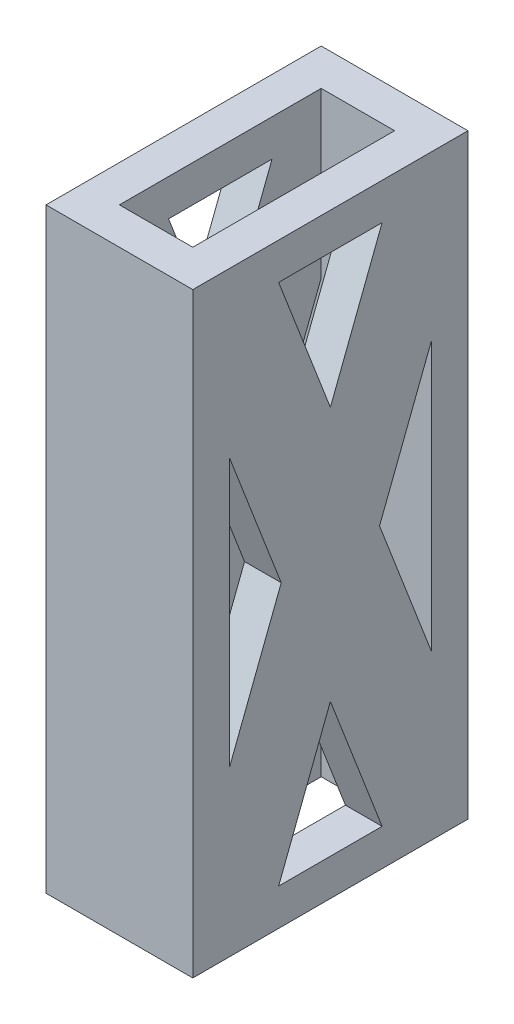
ISO-10303-21;
HEADER;
FILE_DESCRIPTION(('STEP AP214'),'2;1');
FILE_NAME('part.step','',(''),(''),'','','');
FILE_SCHEMA(('AUTOMOTIVE_DESIGN { 1 0 10303 214 1 1 1 1 }'));
ENDSEC;
DATA;
#1=APPLICATION_CONTEXT('core data for automotive mechanical design processes');
#2=APPLICATION_PROTOCOL_DEFINITION('international standard','automotive_design',2000,#1);
#3=PRODUCT_CONTEXT('',#1,'mechanical');
#4=PRODUCT('Part','Part','',(#3));
#5=PRODUCT_RELATED_PRODUCT_CATEGORY('part','',(#4));
#6=PRODUCT_DEFINITION_FORMATION('','',#4);
#7=PRODUCT_DEFINITION_CONTEXT('part definition',#1,'design');
#8=PRODUCT_DEFINITION('design','',#6,#7);
#9=PRODUCT_DEFINITION_SHAPE('','',#8);
#10=(LENGTH_UNIT() NAMED_UNIT(*) SI_UNIT(.MILLI.,.METRE.));
#11=(NAMED_UNIT(*) PLANE_ANGLE_UNIT() SI_UNIT($,.RADIAN.));
#12=(NAMED_UNIT(*) SI_UNIT($,.STERADIAN.) SOLID_ANGLE_UNIT());
#13=UNCERTAINTY_MEASURE_WITH_UNIT(LENGTH_MEASURE(1.E-05),#10,'distance_accuracy_value','');
#14=(GEOMETRIC_REPRESENTATION_CONTEXT(3) GLOBAL_UNCERTAINTY_ASSIGNED_CONTEXT((#13)) GLOBAL_UNIT_ASSIGNED_CONTEXT((#10,
#11,#12)) REPRESENTATION_CONTEXT('',''));
#15=CARTESIAN_POINT('',(0.,0.,0.));
#16=DIRECTION('',(0.,0.,1.));
#17=DIRECTION('',(1.,0.,0.));
#18=AXIS2_PLACEMENT_3D('',#15,#16,#17);
#19=CARTESIAN_POINT('',(0.,32.5,0.));
#20=DIRECTION('',(1.,0.,0.));
#21=DIRECTION('',(0.,0.,-1.));
#22=AXIS2_PLACEMENT_3D('',#19,#20,#21);
#23=PLANE('',#22);
#24=DIRECTION('',(0.,-0.93292313004258,-0.360075594051522));
#25=VECTOR('',#24,1.);
#26=CARTESIAN_POINT('',(0.,-1.31272581877467,3.40115325773436));
#27=LINE('',#26,#25);
#28=CARTESIAN_POINT('',(0.,9.30701346800449,7.5));
#29=VERTEX_POINT('',#28);
#30=CARTESIAN_POINT('',(0.,2.,4.67974918778774));
#31=VERTEX_POINT('',#30);
#32=EDGE_CURVE('E325',#29,#31,#27,.T.);
#33=ORIENTED_EDGE('',*,*,#32,.F.);
#34=DIRECTION('',(0.,-0.93292313004258,0.360075594051522));
#35=VECTOR('',#34,1.);
#36=CARTESIAN_POINT('',(0.,3.72611693504264,9.6540302407923));
#37=LINE('',#36,#35);
#38=CARTESIAN_POINT('',(0.,2.00000000000001,10.3202508122123));
#39=VERTEX_POINT('',#38);
#40=EDGE_CURVE('E336',#29,#39,#37,.T.);
#41=ORIENTED_EDGE('',*,*,#40,.T.);
#42=DIRECTION('',(0.,0.,1.));
#43=VECTOR('',#42,1.);
#44=CARTESIAN_POINT('',(0.,2.,0.));
#45=LINE('',#44,#43);
#46=EDGE_CURVE('E344',#31,#39,#45,.T.);
#47=ORIENTED_EDGE('',*,*,#46,.F.);
#48=EDGE_LOOP('',(#33,#41,#47));
#49=FACE_BOUND('',#48,.T.);
#50=DIRECTION('',(0.,0.,1.));
#51=VECTOR('',#50,1.);
#52=CARTESIAN_POINT('',(0.,0.,0.));
#53=LINE('',#52,#51);
#54=CARTESIAN_POINT('',(0.,0.,0.));
#55=VERTEX_POINT('',#54);
#56=CARTESIAN_POINT('',(0.,0.,15.));
#57=VERTEX_POINT('',#56);
#58=EDGE_CURVE('E557',#55,#57,#53,.T.);
#59=ORIENTED_EDGE('',*,*,#58,.T.);
#60=DIRECTION('',(0.,-1.,0.));
#61=VECTOR('',#60,1.);
#62=CARTESIAN_POINT('',(0.,32.5,15.));
#63=LINE('',#62,#61);
#64=CARTESIAN_POINT('',(0.,32.5,15.));
#65=VERTEX_POINT('',#64);
#66=EDGE_CURVE('E595',#65,#57,#63,.T.);
#67=ORIENTED_EDGE('',*,*,#66,.F.);
#68=DIRECTION('',(0.,0.,1.));
#69=VECTOR('',#68,1.);
#70=CARTESIAN_POINT('',(0.,32.5,0.));
#71=LINE('',#70,#69);
#72=CARTESIAN_POINT('',(0.,32.5,0.));
#73=VERTEX_POINT('',#72);
#74=EDGE_CURVE('E558',#73,#65,#71,.T.);
#75=ORIENTED_EDGE('',*,*,#74,.F.);
#76=DIRECTION('',(0.,-1.,0.));
#77=VECTOR('',#76,1.);
#78=CARTESIAN_POINT('',(0.,32.5,0.));
#79=LINE('',#78,#77);
#80=EDGE_CURVE('E572',#73,#55,#79,.T.);
#81=ORIENTED_EDGE('',*,*,#80,.T.);
#82=EDGE_LOOP('',(#59,#67,#75,#81));
#83=FACE_BOUND('',#82,.T.);
#84=DIRECTION('',(0.,0.,-1.));
#85=VECTOR('',#84,1.);
#86=CARTESIAN_POINT('',(0.,30.5,0.));
#87=LINE('',#86,#85);
#88=CARTESIAN_POINT('',(0.,30.5,10.3202508122123));
#89=VERTEX_POINT('',#88);
#90=CARTESIAN_POINT('',(0.,30.5,4.67974918778774));
#91=VERTEX_POINT('',#90);
#92=EDGE_CURVE('E437',#89,#91,#87,.T.);
#93=ORIENTED_EDGE('',*,*,#92,.F.);
#94=DIRECTION('',(0.,-0.93292313004258,-0.360075594051522));
#95=VECTOR('',#94,1.);
#96=CARTESIAN_POINT('',(0.,0.487652151482941,-1.26346239247853));
#97=LINE('',#96,#95);
#98=CARTESIAN_POINT('',(0.,23.1929865319955,7.5));
#99=VERTEX_POINT('',#98);
#100=EDGE_CURVE('E440',#89,#99,#97,.T.);
#101=ORIENTED_EDGE('',*,*,#100,.T.);
#102=DIRECTION('',(0.,-0.93292313004258,0.360075594051521));
#103=VECTOR('',#102,1.);
#104=CARTESIAN_POINT('',(0.,5.52649490530023,14.3186458910052));
#105=LINE('',#104,#103);
#106=EDGE_CURVE('E445',#91,#99,#105,.T.);
#107=ORIENTED_EDGE('',*,*,#106,.F.);
#108=EDGE_LOOP('',(#93,#101,#107));
#109=FACE_BOUND('',#108,.T.);
#110=DIRECTION('',(0.,-1.,0.));
#111=VECTOR('',#110,1.);
#112=CARTESIAN_POINT('',(0.,0.,2.));
#113=LINE('',#112,#111);
#114=CARTESIAN_POINT('',(0.,23.5570134680045,2.));
#115=VERTEX_POINT('',#114);
#116=CARTESIAN_POINT('',(0.,8.94298653199552,2.));
#117=VERTEX_POINT('',#116);
#118=EDGE_CURVE('E415',#115,#117,#113,.T.);
#119=ORIENTED_EDGE('',*,*,#118,.F.);
#120=DIRECTION('',(0.,-0.93292313004258,0.360075594051522));
#121=VECTOR('',#120,1.);
#122=CARTESIAN_POINT('',(0.,3.72611693504264,9.6540302407923));
#123=LINE('',#122,#121);
#124=CARTESIAN_POINT('',(0.,16.25,4.82025081221226));
#125=VERTEX_POINT('',#124);
#126=EDGE_CURVE('E406',#115,#125,#123,.T.);
#127=ORIENTED_EDGE('',*,*,#126,.T.);
#128=DIRECTION('',(0.,-0.93292313004258,-0.360075594051522));
#129=VECTOR('',#128,1.);
#130=CARTESIAN_POINT('',(0.,0.487652151482943,-1.26346239247854));
#131=LINE('',#130,#129);
#132=EDGE_CURVE('E410',#125,#117,#131,.T.);
#133=ORIENTED_EDGE('',*,*,#132,.T.);
#134=EDGE_LOOP('',(#119,#127,#133));
#135=FACE_BOUND('',#134,.T.);
#136=DIRECTION('',(0.,-0.93292313004258,-0.360075594051522));
#137=VECTOR('',#136,1.);
#138=CARTESIAN_POINT('',(0.,-1.31272581877467,3.40115325773436));
#139=LINE('',#138,#137);
#140=CARTESIAN_POINT('',(0.,23.5570134680045,13.));
#141=VERTEX_POINT('',#140);
#142=CARTESIAN_POINT('',(0.,16.25,10.1797491877877));
#143=VERTEX_POINT('',#142);
#144=EDGE_CURVE('E371',#141,#143,#139,.T.);
#145=ORIENTED_EDGE('',*,*,#144,.F.);
#146=DIRECTION('',(0.,1.,0.));
#147=VECTOR('',#146,1.);
#148=CARTESIAN_POINT('',(0.,0.,13.));
#149=LINE('',#148,#147);
#150=CARTESIAN_POINT('',(0.,8.94298653199546,13.));
#151=VERTEX_POINT('',#150);
#152=EDGE_CURVE('E374',#151,#141,#149,.T.);
#153=ORIENTED_EDGE('',*,*,#152,.F.);
#154=DIRECTION('',(0.,-0.93292313004258,0.360075594051521));
#155=VECTOR('',#154,1.);
#156=CARTESIAN_POINT('',(0.,5.52649490530024,14.3186458910052));
#157=LINE('',#156,#155);
#158=EDGE_CURVE('E378',#143,#151,#157,.T.);
#159=ORIENTED_EDGE('',*,*,#158,.F.);
#160=EDGE_LOOP('',(#145,#153,#159));
#161=FACE_BOUND('',#160,.T.);
#162=ADVANCED_FACE('F111',(#49,#83,#109,#135,#161),#23,.F.);
#163=CARTESIAN_POINT('',(8.,32.5,0.));
#164=DIRECTION('',(-1.,0.,0.));
#165=DIRECTION('',(0.,0.,1.));
#166=AXIS2_PLACEMENT_3D('',#163,#164,#165);
#167=PLANE('',#166);
#168=DIRECTION('',(0.,-0.93292313004258,-0.360075594051522));
#169=VECTOR('',#168,1.);
#170=CARTESIAN_POINT('',(8.,-1.31272581877467,3.40115325773436));
#171=LINE('',#170,#169);
#172=CARTESIAN_POINT('',(8.,9.30701346800449,7.5));
#173=VERTEX_POINT('',#172);
#174=CARTESIAN_POINT('',(8.,2.,4.67974918778774));
#175=VERTEX_POINT('',#174);
#176=EDGE_CURVE('E357',#173,#175,#171,.T.);
#177=ORIENTED_EDGE('',*,*,#176,.T.);
#178=DIRECTION('',(0.,0.,1.));
#179=VECTOR('',#178,1.);
#180=CARTESIAN_POINT('',(8.,2.,0.));
#181=LINE('',#180,#179);
#182=CARTESIAN_POINT('',(8.,2.,10.3202508122123));
#183=VERTEX_POINT('',#182);
#184=EDGE_CURVE('E348',#175,#183,#181,.T.);
#185=ORIENTED_EDGE('',*,*,#184,.T.);
#186=DIRECTION('',(0.,-0.93292313004258,0.360075594051522));
#187=VECTOR('',#186,1.);
#188=CARTESIAN_POINT('',(8.,3.72611693504264,9.6540302407923));
#189=LINE('',#188,#187);
#190=EDGE_CURVE('E352',#173,#183,#189,.T.);
#191=ORIENTED_EDGE('',*,*,#190,.F.);
#192=EDGE_LOOP('',(#177,#185,#191));
#193=FACE_BOUND('',#192,.T.);
#194=DIRECTION('',(0.,0.,-1.));
#195=VECTOR('',#194,1.);
#196=CARTESIAN_POINT('',(8.,0.,0.));
#197=LINE('',#196,#195);
#198=CARTESIAN_POINT('',(8.,0.,15.));
#199=VERTEX_POINT('',#198);
#200=CARTESIAN_POINT('',(8.,0.,0.));
#201=VERTEX_POINT('',#200);
#202=EDGE_CURVE('E579',#199,#201,#197,.T.);
#203=ORIENTED_EDGE('',*,*,#202,.T.);
#204=DIRECTION('',(0.,-1.,0.));
#205=VECTOR('',#204,1.);
#206=CARTESIAN_POINT('',(8.,32.5,0.));
#207=LINE('',#206,#205);
#208=CARTESIAN_POINT('',(8.,32.5,0.));
#209=VERTEX_POINT('',#208);
#210=EDGE_CURVE('E587',#209,#201,#207,.T.);
#211=ORIENTED_EDGE('',*,*,#210,.F.);
#212=DIRECTION('',(0.,0.,-1.));
#213=VECTOR('',#212,1.);
#214=CARTESIAN_POINT('',(8.,32.5,0.));
#215=LINE('',#214,#213);
#216=CARTESIAN_POINT('',(8.,32.5,15.));
#217=VERTEX_POINT('',#216);
#218=EDGE_CURVE('E566',#217,#209,#215,.T.);
#219=ORIENTED_EDGE('',*,*,#218,.F.);
#220=DIRECTION('',(0.,-1.,0.));
#221=VECTOR('',#220,1.);
#222=CARTESIAN_POINT('',(8.,32.5,15.));
#223=LINE('',#222,#221);
#224=EDGE_CURVE('E591',#217,#199,#223,.T.);
#225=ORIENTED_EDGE('',*,*,#224,.T.);
#226=EDGE_LOOP('',(#203,#211,#219,#225));
#227=FACE_BOUND('',#226,.T.);
#228=DIRECTION('',(0.,0.,-1.));
#229=VECTOR('',#228,1.);
#230=CARTESIAN_POINT('',(8.,30.5,0.));
#231=LINE('',#230,#229);
#232=CARTESIAN_POINT('',(8.,30.5,10.3202508122123));
#233=VERTEX_POINT('',#232);
#234=CARTESIAN_POINT('',(8.,30.5,4.67974918778774));
#235=VERTEX_POINT('',#234);
#236=EDGE_CURVE('E398',#233,#235,#231,.T.);
#237=ORIENTED_EDGE('',*,*,#236,.T.);
#238=DIRECTION('',(0.,-0.93292313004258,0.360075594051521));
#239=VECTOR('',#238,1.);
#240=CARTESIAN_POINT('',(8.,5.52649490530023,14.3186458910052));
#241=LINE('',#240,#239);
#242=CARTESIAN_POINT('',(8.,23.1929865319955,7.5));
#243=VERTEX_POINT('',#242);
#244=EDGE_CURVE('E441',#235,#243,#241,.T.);
#245=ORIENTED_EDGE('',*,*,#244,.T.);
#246=DIRECTION('',(0.,-0.93292313004258,-0.360075594051522));
#247=VECTOR('',#246,1.);
#248=CARTESIAN_POINT('',(8.,0.487652151482941,-1.26346239247853));
#249=LINE('',#248,#247);
#250=EDGE_CURVE('E453',#233,#243,#249,.T.);
#251=ORIENTED_EDGE('',*,*,#250,.F.);
#252=EDGE_LOOP('',(#237,#245,#251));
#253=FACE_BOUND('',#252,.T.);
#254=DIRECTION('',(0.,-0.93292313004258,-0.360075594051522));
#255=VECTOR('',#254,1.);
#256=CARTESIAN_POINT('',(8.,0.487652151482943,-1.26346239247854));
#257=LINE('',#256,#255);
#258=CARTESIAN_POINT('',(8.,16.25,4.82025081221226));
#259=VERTEX_POINT('',#258);
#260=CARTESIAN_POINT('',(8.,8.94298653199552,2.));
#261=VERTEX_POINT('',#260);
#262=EDGE_CURVE('E421',#259,#261,#257,.T.);
#263=ORIENTED_EDGE('',*,*,#262,.F.);
#264=DIRECTION('',(0.,-0.93292313004258,0.360075594051522));
#265=VECTOR('',#264,1.);
#266=CARTESIAN_POINT('',(8.,3.72611693504264,9.6540302407923));
#267=LINE('',#266,#265);
#268=CARTESIAN_POINT('',(8.,23.5570134680045,2.));
#269=VERTEX_POINT('',#268);
#270=EDGE_CURVE('E367',#269,#259,#267,.T.);
#271=ORIENTED_EDGE('',*,*,#270,.F.);
#272=DIRECTION('',(0.,-1.,0.));
#273=VECTOR('',#272,1.);
#274=CARTESIAN_POINT('',(8.,0.,2.));
#275=LINE('',#274,#273);
#276=EDGE_CURVE('E411',#269,#261,#275,.T.);
#277=ORIENTED_EDGE('',*,*,#276,.T.);
#278=EDGE_LOOP('',(#263,#271,#277));
#279=FACE_BOUND('',#278,.T.);
#280=DIRECTION('',(0.,-0.93292313004258,-0.360075594051522));
#281=VECTOR('',#280,1.);
#282=CARTESIAN_POINT('',(8.,-1.31272581877467,3.40115325773436));
#283=LINE('',#282,#281);
#284=CARTESIAN_POINT('',(8.,23.5570134680045,13.));
#285=VERTEX_POINT('',#284);
#286=CARTESIAN_POINT('',(8.,16.25,10.1797491877877));
#287=VERTEX_POINT('',#286);
#288=EDGE_CURVE('E382',#285,#287,#283,.T.);
#289=ORIENTED_EDGE('',*,*,#288,.T.);
#290=DIRECTION('',(0.,-0.93292313004258,0.360075594051521));
#291=VECTOR('',#290,1.);
#292=CARTESIAN_POINT('',(8.,5.52649490530024,14.3186458910052));
#293=LINE('',#292,#291);
#294=CARTESIAN_POINT('',(8.,8.94298653199546,13.));
#295=VERTEX_POINT('',#294);
#296=EDGE_CURVE('E375',#287,#295,#293,.T.);
#297=ORIENTED_EDGE('',*,*,#296,.T.);
#298=DIRECTION('',(0.,1.,0.));
#299=VECTOR('',#298,1.);
#300=CARTESIAN_POINT('',(8.,0.,13.));
#301=LINE('',#300,#299);
#302=EDGE_CURVE('E386',#295,#285,#301,.T.);
#303=ORIENTED_EDGE('',*,*,#302,.T.);
#304=EDGE_LOOP('',(#289,#297,#303));
#305=FACE_BOUND('',#304,.T.);
#306=ADVANCED_FACE('F658',(#193,#227,#253,#279,#305),#167,.F.);
#307=CARTESIAN_POINT('',(2.,32.5,2.));
#308=DIRECTION('',(1.,0.,0.));
#309=DIRECTION('',(0.,0.,-1.));
#310=AXIS2_PLACEMENT_3D('',#307,#308,#309);
#311=PLANE('',#310);
#312=DIRECTION('',(0.,-0.93292313004258,-0.360075594051522));
#313=VECTOR('',#312,1.);
#314=CARTESIAN_POINT('',(2.,29.4457287654663,9.91333910765541));
#315=LINE('',#314,#313);
#316=CARTESIAN_POINT('',(2.,30.5,10.3202508122123));
#317=VERTEX_POINT('',#316);
#318=CARTESIAN_POINT('',(2.,23.1929865319955,7.5));
#319=VERTEX_POINT('',#318);
#320=EDGE_CURVE('E464',#317,#319,#315,.T.);
#321=ORIENTED_EDGE('',*,*,#320,.F.);
#322=DIRECTION('',(0.,0.,-1.));
#323=VECTOR('',#322,1.);
#324=CARTESIAN_POINT('',(2.,30.5,2.));
#325=LINE('',#324,#323);
#326=CARTESIAN_POINT('',(2.,30.5,4.67974918778774));
#327=VERTEX_POINT('',#326);
#328=EDGE_CURVE('E480',#317,#327,#325,.T.);
#329=ORIENTED_EDGE('',*,*,#328,.T.);
#330=DIRECTION('',(0.,-0.93292313004258,0.360075594051521));
#331=VECTOR('',#330,1.);
#332=CARTESIAN_POINT('',(2.,33.1408801182657,3.66046212459748));
#333=LINE('',#332,#331);
#334=EDGE_CURVE('E476',#327,#319,#333,.T.);
#335=ORIENTED_EDGE('',*,*,#334,.T.);
#336=EDGE_LOOP('',(#321,#329,#335));
#337=FACE_BOUND('',#336,.T.);
#338=DIRECTION('',(0.,-0.93292313004258,0.360075594051522));
#339=VECTOR('',#338,1.);
#340=CARTESIAN_POINT('',(2.,31.3405021480081,-1.00415352561542));
#341=LINE('',#340,#339);
#342=CARTESIAN_POINT('',(2.,9.30701346800449,7.5));
#343=VERTEX_POINT('',#342);
#344=CARTESIAN_POINT('',(2.,2.,10.3202508122123));
#345=VERTEX_POINT('',#344);
#346=EDGE_CURVE('E484',#343,#345,#341,.T.);
#347=ORIENTED_EDGE('',*,*,#346,.F.);
#348=DIRECTION('',(0.,-0.93292313004258,-0.360075594051522));
#349=VECTOR('',#348,1.);
#350=CARTESIAN_POINT('',(2.,27.6453507952087,14.5779547578683));
#351=LINE('',#350,#349);
#352=CARTESIAN_POINT('',(2.,2.,4.67974918778774));
#353=VERTEX_POINT('',#352);
#354=EDGE_CURVE('E328',#343,#353,#351,.T.);
#355=ORIENTED_EDGE('',*,*,#354,.T.);
#356=DIRECTION('',(0.,0.,1.));
#357=VECTOR('',#356,1.);
#358=CARTESIAN_POINT('',(2.,2.,1.99999999999999));
#359=LINE('',#358,#357);
#360=EDGE_CURVE('E487',#353,#345,#359,.T.);
#361=ORIENTED_EDGE('',*,*,#360,.T.);
#362=EDGE_LOOP('',(#347,#355,#361));
#363=FACE_BOUND('',#362,.T.);
#364=DIRECTION('',(0.,-1.,0.));
#365=VECTOR('',#364,1.);
#366=CARTESIAN_POINT('',(2.,32.5,13.));
#367=LINE('',#366,#365);
#368=CARTESIAN_POINT('',(2.,32.5,13.));
#369=VERTEX_POINT('',#368);
#370=CARTESIAN_POINT('',(2.,23.5570134680045,13.));
#371=VERTEX_POINT('',#370);
#372=EDGE_CURVE('E548',#369,#371,#367,.T.);
#373=ORIENTED_EDGE('',*,*,#372,.T.);
#374=DIRECTION('',(0.,-0.93292313004258,-0.360075594051522));
#375=VECTOR('',#374,1.);
#376=CARTESIAN_POINT('',(2.,27.6453507952087,14.5779547578683));
#377=LINE('',#376,#375);
#378=CARTESIAN_POINT('',(2.,16.25,10.1797491877877));
#379=VERTEX_POINT('',#378);
#380=EDGE_CURVE('E504',#371,#379,#377,.T.);
#381=ORIENTED_EDGE('',*,*,#380,.T.);
#382=DIRECTION('',(0.,-0.93292313004258,0.360075594051521));
#383=VECTOR('',#382,1.);
#384=CARTESIAN_POINT('',(2.,33.1408801182657,3.66046212459748));
#385=LINE('',#384,#383);
#386=CARTESIAN_POINT('',(2.,8.94298653199546,13.));
#387=VERTEX_POINT('',#386);
#388=EDGE_CURVE('E500',#379,#387,#385,.T.);
#389=ORIENTED_EDGE('',*,*,#388,.T.);
#390=CARTESIAN_POINT('',(2.,0.,13.));
#391=VERTEX_POINT('',#390);
#392=EDGE_CURVE('E547',#387,#391,#367,.T.);
#393=ORIENTED_EDGE('',*,*,#392,.T.);
#394=DIRECTION('',(0.,0.,1.));
#395=VECTOR('',#394,1.);
#396=CARTESIAN_POINT('',(2.,0.,2.));
#397=LINE('',#396,#395);
#398=CARTESIAN_POINT('',(2.,0.,2.));
#399=VERTEX_POINT('',#398);
#400=EDGE_CURVE('E527',#399,#391,#397,.T.);
#401=ORIENTED_EDGE('',*,*,#400,.F.);
#402=DIRECTION('',(0.,-1.,0.));
#403=VECTOR('',#402,1.);
#404=CARTESIAN_POINT('',(2.,32.5,2.));
#405=LINE('',#404,#403);
#406=CARTESIAN_POINT('',(2.,8.94298653199552,2.));
#407=VERTEX_POINT('',#406);
#408=EDGE_CURVE('E552',#407,#399,#405,.T.);
#409=ORIENTED_EDGE('',*,*,#408,.F.);
#410=DIRECTION('',(0.,-0.93292313004258,-0.360075594051522));
#411=VECTOR('',#410,1.);
#412=CARTESIAN_POINT('',(2.,29.4457287654663,9.9133391076554));
#413=LINE('',#412,#411);
#414=CARTESIAN_POINT('',(2.,16.25,4.82025081221226));
#415=VERTEX_POINT('',#414);
#416=EDGE_CURVE('E493',#415,#407,#413,.T.);
#417=ORIENTED_EDGE('',*,*,#416,.F.);
#418=DIRECTION('',(0.,-0.93292313004258,0.360075594051522));
#419=VECTOR('',#418,1.);
#420=CARTESIAN_POINT('',(2.,31.3405021480081,-1.00415352561542));
#421=LINE('',#420,#419);
#422=CARTESIAN_POINT('',(2.,23.5570134680045,2.));
#423=VERTEX_POINT('',#422);
#424=EDGE_CURVE('E496',#423,#415,#421,.T.);
#425=ORIENTED_EDGE('',*,*,#424,.F.);
#426=CARTESIAN_POINT('',(2.,32.5,2.));
#427=VERTEX_POINT('',#426);
#428=EDGE_CURVE('E553',#427,#423,#405,.T.);
#429=ORIENTED_EDGE('',*,*,#428,.F.);
#430=DIRECTION('',(0.,0.,1.));
#431=VECTOR('',#430,1.);
#432=CARTESIAN_POINT('',(2.,32.5,2.));
#433=LINE('',#432,#431);
#434=EDGE_CURVE('E512',#427,#369,#433,.T.);
#435=ORIENTED_EDGE('',*,*,#434,.T.);
#436=EDGE_LOOP('',(#373,#381,#389,#393,#401,#409,#417,#425,#429,#435));
#437=FACE_BOUND('',#436,.T.);
#438=ADVANCED_FACE('F688',(#337,#363,#437),#311,.T.);
#439=CARTESIAN_POINT('',(6.,32.5,2.));
#440=DIRECTION('',(-1.,0.,0.));
#441=DIRECTION('',(0.,0.,1.));
#442=AXIS2_PLACEMENT_3D('',#439,#440,#441);
#443=PLANE('',#442);
#444=DIRECTION('',(0.,0.93292313004258,-0.360075594051521));
#445=VECTOR('',#444,1.);
#446=CARTESIAN_POINT('',(6.,33.1408801182657,3.66046212459748));
#447=LINE('',#446,#445);
#448=CARTESIAN_POINT('',(6.,23.1929865319955,7.5));
#449=VERTEX_POINT('',#448);
#450=CARTESIAN_POINT('',(6.,30.5,4.67974918778774));
#451=VERTEX_POINT('',#450);
#452=EDGE_CURVE('E602',#449,#451,#447,.T.);
#453=ORIENTED_EDGE('',*,*,#452,.T.);
#454=DIRECTION('',(0.,0.,1.));
#455=VECTOR('',#454,1.);
#456=CARTESIAN_POINT('',(6.,30.5,2.));
#457=LINE('',#456,#455);
#458=CARTESIAN_POINT('',(6.,30.5,10.3202508122123));
#459=VERTEX_POINT('',#458);
#460=EDGE_CURVE('E606',#451,#459,#457,.T.);
#461=ORIENTED_EDGE('',*,*,#460,.T.);
#462=DIRECTION('',(0.,0.93292313004258,0.360075594051522));
#463=VECTOR('',#462,1.);
#464=CARTESIAN_POINT('',(6.,29.4457287654663,9.91333910765541));
#465=LINE('',#464,#463);
#466=EDGE_CURVE('E599',#449,#459,#465,.T.);
#467=ORIENTED_EDGE('',*,*,#466,.F.);
#468=EDGE_LOOP('',(#453,#461,#467));
#469=FACE_BOUND('',#468,.T.);
#470=DIRECTION('',(0.,0.,-1.));
#471=VECTOR('',#470,1.);
#472=CARTESIAN_POINT('',(6.,2.,1.99999999999999));
#473=LINE('',#472,#471);
#474=CARTESIAN_POINT('',(6.,2.,10.3202508122123));
#475=VERTEX_POINT('',#474);
#476=CARTESIAN_POINT('',(6.,2.,4.67974918778774));
#477=VERTEX_POINT('',#476);
#478=EDGE_CURVE('E613',#475,#477,#473,.T.);
#479=ORIENTED_EDGE('',*,*,#478,.T.);
#480=DIRECTION('',(0.,0.93292313004258,0.360075594051522));
#481=VECTOR('',#480,1.);
#482=CARTESIAN_POINT('',(6.,27.6453507952087,14.5779547578683));
#483=LINE('',#482,#481);
#484=CARTESIAN_POINT('',(6.,9.30701346800449,7.5));
#485=VERTEX_POINT('',#484);
#486=EDGE_CURVE('E617',#477,#485,#483,.T.);
#487=ORIENTED_EDGE('',*,*,#486,.T.);
#488=DIRECTION('',(0.,0.93292313004258,-0.360075594051522));
#489=VECTOR('',#488,1.);
#490=CARTESIAN_POINT('',(6.,31.3405021480081,-1.00415352561542));
#491=LINE('',#490,#489);
#492=EDGE_CURVE('E610',#475,#485,#491,.T.);
#493=ORIENTED_EDGE('',*,*,#492,.F.);
#494=EDGE_LOOP('',(#479,#487,#493));
#495=FACE_BOUND('',#494,.T.);
#496=DIRECTION('',(0.,0.93292313004258,-0.360075594051521));
#497=VECTOR('',#496,1.);
#498=CARTESIAN_POINT('',(6.,33.1408801182657,3.66046212459748));
#499=LINE('',#498,#497);
#500=CARTESIAN_POINT('',(6.,8.94298653199546,13.));
#501=VERTEX_POINT('',#500);
#502=CARTESIAN_POINT('',(6.,16.25,10.1797491877877));
#503=VERTEX_POINT('',#502);
#504=EDGE_CURVE('E119',#501,#503,#499,.T.);
#505=ORIENTED_EDGE('',*,*,#504,.T.);
#506=DIRECTION('',(0.,0.93292313004258,0.360075594051522));
#507=VECTOR('',#506,1.);
#508=CARTESIAN_POINT('',(6.,27.6453507952087,14.5779547578683));
#509=LINE('',#508,#507);
#510=CARTESIAN_POINT('',(6.,23.5570134680045,13.));
#511=VERTEX_POINT('',#510);
#512=EDGE_CURVE('E12',#503,#511,#509,.T.);
#513=ORIENTED_EDGE('',*,*,#512,.T.);
#514=DIRECTION('',(0.,-1.,0.));
#515=VECTOR('',#514,1.);
#516=CARTESIAN_POINT('',(6.,32.5,13.));
#517=LINE('',#516,#515);
#518=CARTESIAN_POINT('',(6.,32.5,13.));
#519=VERTEX_POINT('',#518);
#520=EDGE_CURVE('E543',#519,#511,#517,.T.);
#521=ORIENTED_EDGE('',*,*,#520,.F.);
#522=DIRECTION('',(0.,0.,-1.));
#523=VECTOR('',#522,1.);
#524=CARTESIAN_POINT('',(6.,32.5,2.));
#525=LINE('',#524,#523);
#526=CARTESIAN_POINT('',(6.,32.5,2.));
#527=VERTEX_POINT('',#526);
#528=EDGE_CURVE('E520',#519,#527,#525,.T.);
#529=ORIENTED_EDGE('',*,*,#528,.T.);
#530=DIRECTION('',(0.,-1.,0.));
#531=VECTOR('',#530,1.);
#532=CARTESIAN_POINT('',(6.,32.5,2.));
#533=LINE('',#532,#531);
#534=CARTESIAN_POINT('',(6.,23.5570134680045,2.));
#535=VERTEX_POINT('',#534);
#536=EDGE_CURVE('E538',#527,#535,#533,.T.);
#537=ORIENTED_EDGE('',*,*,#536,.T.);
#538=DIRECTION('',(0.,0.93292313004258,-0.360075594051522));
#539=VECTOR('',#538,1.);
#540=CARTESIAN_POINT('',(6.,31.3405021480081,-1.00415352561542));
#541=LINE('',#540,#539);
#542=CARTESIAN_POINT('',(6.,16.25,4.82025081221226));
#543=VERTEX_POINT('',#542);
#544=EDGE_CURVE('E624',#543,#535,#541,.T.);
#545=ORIENTED_EDGE('',*,*,#544,.F.);
#546=DIRECTION('',(0.,0.93292313004258,0.360075594051522));
#547=VECTOR('',#546,1.);
#548=CARTESIAN_POINT('',(6.,29.4457287654663,9.9133391076554));
#549=LINE('',#548,#547);
#550=CARTESIAN_POINT('',(6.,8.94298653199552,2.));
#551=VERTEX_POINT('',#550);
#552=EDGE_CURVE('E621',#551,#543,#549,.T.);
#553=ORIENTED_EDGE('',*,*,#552,.F.);
#554=CARTESIAN_POINT('',(6.,0.,2.));
#555=VERTEX_POINT('',#554);
#556=EDGE_CURVE('E523',#551,#555,#533,.T.);
#557=ORIENTED_EDGE('',*,*,#556,.T.);
#558=DIRECTION('',(0.,0.,-1.));
#559=VECTOR('',#558,1.);
#560=CARTESIAN_POINT('',(6.,0.,2.));
#561=LINE('',#560,#559);
#562=CARTESIAN_POINT('',(6.,0.,13.));
#563=VERTEX_POINT('',#562);
#564=EDGE_CURVE('E513',#563,#555,#561,.T.);
#565=ORIENTED_EDGE('',*,*,#564,.F.);
#566=EDGE_CURVE('E542',#501,#563,#517,.T.);
#567=ORIENTED_EDGE('',*,*,#566,.F.);
#568=EDGE_LOOP('',(#505,#513,#521,#529,#537,#545,#553,#557,#565,#567));
#569=FACE_BOUND('',#568,.T.);
#570=ADVANCED_FACE('F631',(#469,#495,#569),#443,.T.);
#571=CARTESIAN_POINT('',(0.,32.5,0.));
#572=DIRECTION('',(0.,1.,0.));
#573=DIRECTION('',(0.,0.,1.));
#574=AXIS2_PLACEMENT_3D('',#571,#572,#573);
#575=PLANE('',#574);
#576=ORIENTED_EDGE('',*,*,#74,.T.);
#577=DIRECTION('',(1.,0.,0.));
#578=VECTOR('',#577,1.);
#579=CARTESIAN_POINT('',(0.,32.5,15.));
#580=LINE('',#579,#578);
#581=EDGE_CURVE('E562',#65,#217,#580,.T.);
#582=ORIENTED_EDGE('',*,*,#581,.T.);
#583=ORIENTED_EDGE('',*,*,#218,.T.);
#584=DIRECTION('',(-1.,0.,0.));
#585=VECTOR('',#584,1.);
#586=CARTESIAN_POINT('',(0.,32.5,0.));
#587=LINE('',#586,#585);
#588=EDGE_CURVE('E569',#209,#73,#587,.T.);
#589=ORIENTED_EDGE('',*,*,#588,.T.);
#590=EDGE_LOOP('',(#576,#582,#583,#589));
#591=FACE_BOUND('',#590,.T.);
#592=ORIENTED_EDGE('',*,*,#434,.F.);
#593=DIRECTION('',(-1.,0.,0.));
#594=VECTOR('',#593,1.);
#595=CARTESIAN_POINT('',(2.,32.5,2.));
#596=LINE('',#595,#594);
#597=EDGE_CURVE('E509',#527,#427,#596,.T.);
#598=ORIENTED_EDGE('',*,*,#597,.F.);
#599=ORIENTED_EDGE('',*,*,#528,.F.);
#600=DIRECTION('',(1.,0.,0.));
#601=VECTOR('',#600,1.);
#602=CARTESIAN_POINT('',(2.,32.5,13.));
#603=LINE('',#602,#601);
#604=EDGE_CURVE('E516',#369,#519,#603,.T.);
#605=ORIENTED_EDGE('',*,*,#604,.F.);
#606=EDGE_LOOP('',(#592,#598,#599,#605));
#607=FACE_BOUND('',#606,.T.);
#608=ADVANCED_FACE('F708',(#591,#607),#575,.T.);
#609=CARTESIAN_POINT('',(0.,0.,0.));
#610=DIRECTION('',(0.,1.,0.));
#611=DIRECTION('',(0.,0.,1.));
#612=AXIS2_PLACEMENT_3D('',#609,#610,#611);
#613=PLANE('',#612);
#614=ORIENTED_EDGE('',*,*,#58,.F.);
#615=DIRECTION('',(-1.,0.,0.));
#616=VECTOR('',#615,1.);
#617=CARTESIAN_POINT('',(0.,0.,0.));
#618=LINE('',#617,#616);
#619=EDGE_CURVE('E563',#201,#55,#618,.T.);
#620=ORIENTED_EDGE('',*,*,#619,.F.);
#621=ORIENTED_EDGE('',*,*,#202,.F.);
#622=DIRECTION('',(1.,0.,0.));
#623=VECTOR('',#622,1.);
#624=CARTESIAN_POINT('',(0.,0.,15.));
#625=LINE('',#624,#623);
#626=EDGE_CURVE('E576',#57,#199,#625,.T.);
#627=ORIENTED_EDGE('',*,*,#626,.F.);
#628=EDGE_LOOP('',(#614,#620,#621,#627));
#629=FACE_BOUND('',#628,.T.);
#630=DIRECTION('',(-1.,0.,0.));
#631=VECTOR('',#630,1.);
#632=CARTESIAN_POINT('',(2.,0.,2.));
#633=LINE('',#632,#631);
#634=EDGE_CURVE('E508',#555,#399,#633,.T.);
#635=ORIENTED_EDGE('',*,*,#634,.T.);
#636=ORIENTED_EDGE('',*,*,#400,.T.);
#637=DIRECTION('',(1.,0.,0.));
#638=VECTOR('',#637,1.);
#639=CARTESIAN_POINT('',(2.,0.,13.));
#640=LINE('',#639,#638);
#641=EDGE_CURVE('E531',#391,#563,#640,.T.);
#642=ORIENTED_EDGE('',*,*,#641,.T.);
#643=ORIENTED_EDGE('',*,*,#564,.T.);
#644=EDGE_LOOP('',(#635,#636,#642,#643));
#645=FACE_BOUND('',#644,.T.);
#646=ADVANCED_FACE('F700',(#629,#645),#613,.F.);
#647=CARTESIAN_POINT('',(0.,32.5,15.));
#648=DIRECTION('',(0.,0.,-1.));
#649=DIRECTION('',(-1.,0.,0.));
#650=AXIS2_PLACEMENT_3D('',#647,#648,#649);
#651=PLANE('',#650);
#652=ORIENTED_EDGE('',*,*,#626,.T.);
#653=ORIENTED_EDGE('',*,*,#224,.F.);
#654=ORIENTED_EDGE('',*,*,#581,.F.);
#655=ORIENTED_EDGE('',*,*,#66,.T.);
#656=EDGE_LOOP('',(#652,#653,#654,#655));
#657=FACE_BOUND('',#656,.T.);
#658=ADVANCED_FACE('F698',(#657),#651,.F.);
#659=CARTESIAN_POINT('',(0.,32.5,0.));
#660=DIRECTION('',(0.,0.,1.));
#661=DIRECTION('',(1.,0.,0.));
#662=AXIS2_PLACEMENT_3D('',#659,#660,#661);
#663=PLANE('',#662);
#664=ORIENTED_EDGE('',*,*,#619,.T.);
#665=ORIENTED_EDGE('',*,*,#80,.F.);
#666=ORIENTED_EDGE('',*,*,#588,.F.);
#667=ORIENTED_EDGE('',*,*,#210,.T.);
#668=EDGE_LOOP('',(#664,#665,#666,#667));
#669=FACE_BOUND('',#668,.T.);
#670=ADVANCED_FACE('F696',(#669),#663,.F.);
#671=CARTESIAN_POINT('',(2.,32.5,2.));
#672=DIRECTION('',(0.,0.,1.));
#673=DIRECTION('',(1.,0.,0.));
#674=AXIS2_PLACEMENT_3D('',#671,#672,#673);
#675=PLANE('',#674);
#676=ORIENTED_EDGE('',*,*,#556,.F.);
#677=DIRECTION('',(1.,0.,0.));
#678=VECTOR('',#677,1.);
#679=CARTESIAN_POINT('',(0.,8.94298653199552,2.));
#680=LINE('',#679,#678);
#681=EDGE_CURVE('E433',#551,#261,#680,.T.);
#682=ORIENTED_EDGE('',*,*,#681,.T.);
#683=ORIENTED_EDGE('',*,*,#276,.F.);
#684=DIRECTION('',(1.,0.,0.));
#685=VECTOR('',#684,1.);
#686=CARTESIAN_POINT('',(0.,23.5570134680045,2.));
#687=LINE('',#686,#685);
#688=EDGE_CURVE('E430',#535,#269,#687,.T.);
#689=ORIENTED_EDGE('',*,*,#688,.F.);
#690=ORIENTED_EDGE('',*,*,#536,.F.);
#691=ORIENTED_EDGE('',*,*,#597,.T.);
#692=ORIENTED_EDGE('',*,*,#428,.T.);
#693=EDGE_CURVE('E387',#115,#423,#687,.T.);
#694=ORIENTED_EDGE('',*,*,#693,.F.);
#695=ORIENTED_EDGE('',*,*,#118,.T.);
#696=EDGE_CURVE('E134',#117,#407,#680,.T.);
#697=ORIENTED_EDGE('',*,*,#696,.T.);
#698=ORIENTED_EDGE('',*,*,#408,.T.);
#699=ORIENTED_EDGE('',*,*,#634,.F.);
#700=EDGE_LOOP('',(#676,#682,#683,#689,#690,#691,#692,#694,#695,#697,#698,#699));
#701=FACE_BOUND('',#700,.T.);
#702=ADVANCED_FACE('F706',(#701),#675,.T.);
#703=CARTESIAN_POINT('',(2.,32.5,13.));
#704=DIRECTION('',(0.,0.,-1.));
#705=DIRECTION('',(-1.,0.,0.));
#706=AXIS2_PLACEMENT_3D('',#703,#704,#705);
#707=PLANE('',#706);
#708=ORIENTED_EDGE('',*,*,#392,.F.);
#709=DIRECTION('',(1.,0.,0.));
#710=VECTOR('',#709,1.);
#711=CARTESIAN_POINT('',(0.,8.94298653199546,13.));
#712=LINE('',#711,#710);
#713=EDGE_CURVE('E126',#151,#387,#712,.T.);
#714=ORIENTED_EDGE('',*,*,#713,.F.);
#715=ORIENTED_EDGE('',*,*,#152,.T.);
#716=DIRECTION('',(1.,0.,0.));
#717=VECTOR('',#716,1.);
#718=CARTESIAN_POINT('',(0.,23.5570134680045,13.));
#719=LINE('',#718,#717);
#720=EDGE_CURVE('E403',#141,#371,#719,.T.);
#721=ORIENTED_EDGE('',*,*,#720,.T.);
#722=ORIENTED_EDGE('',*,*,#372,.F.);
#723=ORIENTED_EDGE('',*,*,#604,.T.);
#724=ORIENTED_EDGE('',*,*,#520,.T.);
#725=EDGE_CURVE('E381',#511,#285,#719,.T.);
#726=ORIENTED_EDGE('',*,*,#725,.T.);
#727=ORIENTED_EDGE('',*,*,#302,.F.);
#728=EDGE_CURVE('E402',#501,#295,#712,.T.);
#729=ORIENTED_EDGE('',*,*,#728,.F.);
#730=ORIENTED_EDGE('',*,*,#566,.T.);
#731=ORIENTED_EDGE('',*,*,#641,.F.);
#732=EDGE_LOOP('',(#708,#714,#715,#721,#722,#723,#724,#726,#727,#729,#730,#731));
#733=FACE_BOUND('',#732,.T.);
#734=ADVANCED_FACE('F735',(#733),#707,.T.);
#735=CARTESIAN_POINT('',(0.,0.487652151482941,-1.26346239247853));
#736=DIRECTION('',(0.,-0.360075594051522,0.93292313004258));
#737=DIRECTION('',(0.,-0.93292313004258,-0.360075594051522));
#738=AXIS2_PLACEMENT_3D('',#735,#736,#737);
#739=PLANE('',#738);
#740=ORIENTED_EDGE('',*,*,#466,.T.);
#741=DIRECTION('',(1.,0.,0.));
#742=VECTOR('',#741,1.);
#743=CARTESIAN_POINT('',(0.,30.5,10.3202508122123));
#744=LINE('',#743,#742);
#745=EDGE_CURVE('E449',#459,#233,#744,.T.);
#746=ORIENTED_EDGE('',*,*,#745,.T.);
#747=ORIENTED_EDGE('',*,*,#250,.T.);
#748=DIRECTION('',(1.,0.,0.));
#749=VECTOR('',#748,1.);
#750=CARTESIAN_POINT('',(0.,23.1929865319955,7.5));
#751=LINE('',#750,#749);
#752=EDGE_CURVE('E470',#449,#243,#751,.T.);
#753=ORIENTED_EDGE('',*,*,#752,.F.);
#754=EDGE_LOOP('',(#740,#746,#747,#753));
#755=FACE_BOUND('',#754,.T.);
#756=ADVANCED_FACE('F757',(#755),#739,.F.);
#757=CARTESIAN_POINT('',(0.,5.52649490530023,14.3186458910052));
#758=DIRECTION('',(0.,0.360075594051521,0.93292313004258));
#759=DIRECTION('',(0.,-0.93292313004258,0.360075594051521));
#760=AXIS2_PLACEMENT_3D('',#757,#758,#759);
#761=PLANE('',#760);
#762=ORIENTED_EDGE('',*,*,#752,.T.);
#763=ORIENTED_EDGE('',*,*,#244,.F.);
#764=DIRECTION('',(1.,0.,0.));
#765=VECTOR('',#764,1.);
#766=CARTESIAN_POINT('',(0.,30.5,4.67974918778774));
#767=LINE('',#766,#765);
#768=EDGE_CURVE('E465',#451,#235,#767,.T.);
#769=ORIENTED_EDGE('',*,*,#768,.F.);
#770=ORIENTED_EDGE('',*,*,#452,.F.);
#771=EDGE_LOOP('',(#762,#763,#769,#770));
#772=FACE_BOUND('',#771,.T.);
#773=ADVANCED_FACE('F764',(#772),#761,.T.);
#774=CARTESIAN_POINT('',(0.,30.5,0.));
#775=DIRECTION('',(0.,-1.,0.));
#776=DIRECTION('',(0.,0.,-1.));
#777=AXIS2_PLACEMENT_3D('',#774,#775,#776);
#778=PLANE('',#777);
#779=ORIENTED_EDGE('',*,*,#768,.T.);
#780=ORIENTED_EDGE('',*,*,#236,.F.);
#781=ORIENTED_EDGE('',*,*,#745,.F.);
#782=ORIENTED_EDGE('',*,*,#460,.F.);
#783=EDGE_LOOP('',(#779,#780,#781,#782));
#784=FACE_BOUND('',#783,.T.);
#785=ADVANCED_FACE('F767',(#784),#778,.T.);
#786=CARTESIAN_POINT('',(0.,3.72611693504264,9.6540302407923));
#787=DIRECTION('',(0.,0.360075594051522,0.932923130042579));
#788=DIRECTION('',(0.,-0.93292313004258,0.360075594051522));
#789=AXIS2_PLACEMENT_3D('',#786,#787,#788);
#790=PLANE('',#789);
#791=ORIENTED_EDGE('',*,*,#492,.T.);
#792=DIRECTION('',(1.,0.,0.));
#793=VECTOR('',#792,1.);
#794=CARTESIAN_POINT('',(0.,9.30701346800449,7.5));
#795=LINE('',#794,#793);
#796=EDGE_CURVE('E333',#485,#173,#795,.T.);
#797=ORIENTED_EDGE('',*,*,#796,.T.);
#798=ORIENTED_EDGE('',*,*,#190,.T.);
#799=DIRECTION('',(1.,0.,0.));
#800=VECTOR('',#799,1.);
#801=CARTESIAN_POINT('',(0.,2.,10.3202508122123));
#802=LINE('',#801,#800);
#803=EDGE_CURVE('E332',#475,#183,#802,.T.);
#804=ORIENTED_EDGE('',*,*,#803,.F.);
#805=EDGE_LOOP('',(#791,#797,#798,#804));
#806=FACE_BOUND('',#805,.T.);
#807=ADVANCED_FACE('F654',(#806),#790,.F.);
#808=CARTESIAN_POINT('',(0.,2.,0.));
#809=DIRECTION('',(0.,1.,0.));
#810=DIRECTION('',(0.,0.,1.));
#811=AXIS2_PLACEMENT_3D('',#808,#809,#810);
#812=PLANE('',#811);
#813=ORIENTED_EDGE('',*,*,#803,.T.);
#814=ORIENTED_EDGE('',*,*,#184,.F.);
#815=DIRECTION('',(1.,0.,0.));
#816=VECTOR('',#815,1.);
#817=CARTESIAN_POINT('',(0.,2.,4.67974918778774));
#818=LINE('',#817,#816);
#819=EDGE_CURVE('E368',#477,#175,#818,.T.);
#820=ORIENTED_EDGE('',*,*,#819,.F.);
#821=ORIENTED_EDGE('',*,*,#478,.F.);
#822=EDGE_LOOP('',(#813,#814,#820,#821));
#823=FACE_BOUND('',#822,.T.);
#824=ADVANCED_FACE('F663',(#823),#812,.T.);
#825=CARTESIAN_POINT('',(0.,-1.31272581877467,3.40115325773436));
#826=DIRECTION('',(0.,-0.360075594051522,0.93292313004258));
#827=DIRECTION('',(0.,-0.93292313004258,-0.360075594051522));
#828=AXIS2_PLACEMENT_3D('',#825,#826,#827);
#829=PLANE('',#828);
#830=ORIENTED_EDGE('',*,*,#819,.T.);
#831=ORIENTED_EDGE('',*,*,#176,.F.);
#832=ORIENTED_EDGE('',*,*,#796,.F.);
#833=ORIENTED_EDGE('',*,*,#486,.F.);
#834=EDGE_LOOP('',(#830,#831,#832,#833));
#835=FACE_BOUND('',#834,.T.);
#836=ADVANCED_FACE('F666',(#835),#829,.T.);
#837=CARTESIAN_POINT('',(0.,0.487652151482943,-1.26346239247854));
#838=DIRECTION('',(0.,-0.360075594051522,0.932923130042579));
#839=DIRECTION('',(0.,-0.93292313004258,-0.360075594051522));
#840=AXIS2_PLACEMENT_3D('',#837,#838,#839);
#841=PLANE('',#840);
#842=ORIENTED_EDGE('',*,*,#552,.T.);
#843=DIRECTION('',(1.,0.,0.));
#844=VECTOR('',#843,1.);
#845=CARTESIAN_POINT('',(0.,16.25,4.82025081221226));
#846=LINE('',#845,#844);
#847=EDGE_CURVE('E418',#543,#259,#846,.T.);
#848=ORIENTED_EDGE('',*,*,#847,.T.);
#849=ORIENTED_EDGE('',*,*,#262,.T.);
#850=ORIENTED_EDGE('',*,*,#681,.F.);
#851=EDGE_LOOP('',(#842,#848,#849,#850));
#852=FACE_BOUND('',#851,.T.);
#853=ADVANCED_FACE('F668',(#852),#841,.F.);
#854=CARTESIAN_POINT('',(0.,3.72611693504264,9.6540302407923));
#855=DIRECTION('',(0.,0.360075594051522,0.932923130042579));
#856=DIRECTION('',(0.,-0.93292313004258,0.360075594051522));
#857=AXIS2_PLACEMENT_3D('',#854,#855,#856);
#858=PLANE('',#857);
#859=ORIENTED_EDGE('',*,*,#544,.T.);
#860=ORIENTED_EDGE('',*,*,#688,.T.);
#861=ORIENTED_EDGE('',*,*,#270,.T.);
#862=ORIENTED_EDGE('',*,*,#847,.F.);
#863=EDGE_LOOP('',(#859,#860,#861,#862));
#864=FACE_BOUND('',#863,.T.);
#865=ADVANCED_FACE('F674',(#864),#858,.F.);
#866=CARTESIAN_POINT('',(0.,5.52649490530024,14.3186458910052));
#867=DIRECTION('',(0.,0.360075594051521,0.93292313004258));
#868=DIRECTION('',(0.,-0.93292313004258,0.360075594051521));
#869=AXIS2_PLACEMENT_3D('',#866,#867,#868);
#870=PLANE('',#869);
#871=ORIENTED_EDGE('',*,*,#728,.T.);
#872=ORIENTED_EDGE('',*,*,#296,.F.);
#873=DIRECTION('',(1.,0.,0.));
#874=VECTOR('',#873,1.);
#875=CARTESIAN_POINT('',(0.,16.25,10.1797491877877));
#876=LINE('',#875,#874);
#877=EDGE_CURVE('E399',#503,#287,#876,.T.);
#878=ORIENTED_EDGE('',*,*,#877,.F.);
#879=ORIENTED_EDGE('',*,*,#504,.F.);
#880=EDGE_LOOP('',(#871,#872,#878,#879));
#881=FACE_BOUND('',#880,.T.);
#882=ADVANCED_FACE('F635',(#881),#870,.T.);
#883=CARTESIAN_POINT('',(0.,-1.31272581877467,3.40115325773436));
#884=DIRECTION('',(0.,-0.360075594051522,0.932923130042579));
#885=DIRECTION('',(0.,-0.93292313004258,-0.360075594051522));
#886=AXIS2_PLACEMENT_3D('',#883,#884,#885);
#887=PLANE('',#886);
#888=ORIENTED_EDGE('',*,*,#877,.T.);
#889=ORIENTED_EDGE('',*,*,#288,.F.);
#890=ORIENTED_EDGE('',*,*,#725,.F.);
#891=ORIENTED_EDGE('',*,*,#512,.F.);
#892=EDGE_LOOP('',(#888,#889,#890,#891));
#893=FACE_BOUND('',#892,.T.);
#894=ADVANCED_FACE('F780',(#893),#887,.T.);
#895=EDGE_CURVE('E471',#89,#317,#744,.T.);
#896=ORIENTED_EDGE('',*,*,#895,.F.);
#897=ORIENTED_EDGE('',*,*,#92,.T.);
#898=EDGE_CURVE('E460',#91,#327,#767,.T.);
#899=ORIENTED_EDGE('',*,*,#898,.T.);
#900=ORIENTED_EDGE('',*,*,#328,.F.);
#901=EDGE_LOOP('',(#896,#897,#899,#900));
#902=FACE_BOUND('',#901,.T.);
#903=ADVANCED_FACE('F770',(#902),#778,.T.);
#904=ORIENTED_EDGE('',*,*,#898,.F.);
#905=ORIENTED_EDGE('',*,*,#106,.T.);
#906=EDGE_CURVE('E466',#99,#319,#751,.T.);
#907=ORIENTED_EDGE('',*,*,#906,.T.);
#908=ORIENTED_EDGE('',*,*,#334,.F.);
#909=EDGE_LOOP('',(#904,#905,#907,#908));
#910=FACE_BOUND('',#909,.T.);
#911=ADVANCED_FACE('F776',(#910),#761,.T.);
#912=ORIENTED_EDGE('',*,*,#320,.T.);
#913=ORIENTED_EDGE('',*,*,#906,.F.);
#914=ORIENTED_EDGE('',*,*,#100,.F.);
#915=ORIENTED_EDGE('',*,*,#895,.T.);
#916=EDGE_LOOP('',(#912,#913,#914,#915));
#917=FACE_BOUND('',#916,.T.);
#918=ADVANCED_FACE('F683',(#917),#739,.F.);
#919=EDGE_CURVE('E320',#29,#343,#795,.T.);
#920=ORIENTED_EDGE('',*,*,#919,.F.);
#921=ORIENTED_EDGE('',*,*,#32,.T.);
#922=EDGE_CURVE('E364',#31,#353,#818,.T.);
#923=ORIENTED_EDGE('',*,*,#922,.T.);
#924=ORIENTED_EDGE('',*,*,#354,.F.);
#925=EDGE_LOOP('',(#920,#921,#923,#924));
#926=FACE_BOUND('',#925,.T.);
#927=ADVANCED_FACE('F322',(#926),#829,.T.);
#928=ORIENTED_EDGE('',*,*,#922,.F.);
#929=ORIENTED_EDGE('',*,*,#46,.T.);
#930=EDGE_CURVE('E339',#39,#345,#802,.T.);
#931=ORIENTED_EDGE('',*,*,#930,.T.);
#932=ORIENTED_EDGE('',*,*,#360,.F.);
#933=EDGE_LOOP('',(#928,#929,#931,#932));
#934=FACE_BOUND('',#933,.T.);
#935=ADVANCED_FACE('F679',(#934),#812,.T.);
#936=ORIENTED_EDGE('',*,*,#346,.T.);
#937=ORIENTED_EDGE('',*,*,#930,.F.);
#938=ORIENTED_EDGE('',*,*,#40,.F.);
#939=ORIENTED_EDGE('',*,*,#919,.T.);
#940=EDGE_LOOP('',(#936,#937,#938,#939));
#941=FACE_BOUND('',#940,.T.);
#942=ADVANCED_FACE('F337',(#941),#790,.F.);
#943=ORIENTED_EDGE('',*,*,#424,.T.);
#944=EDGE_CURVE('E434',#125,#415,#846,.T.);
#945=ORIENTED_EDGE('',*,*,#944,.F.);
#946=ORIENTED_EDGE('',*,*,#126,.F.);
#947=ORIENTED_EDGE('',*,*,#693,.T.);
#948=EDGE_LOOP('',(#943,#945,#946,#947));
#949=FACE_BOUND('',#948,.T.);
#950=ADVANCED_FACE('F802',(#949),#858,.F.);
#951=ORIENTED_EDGE('',*,*,#416,.T.);
#952=ORIENTED_EDGE('',*,*,#696,.F.);
#953=ORIENTED_EDGE('',*,*,#132,.F.);
#954=ORIENTED_EDGE('',*,*,#944,.T.);
#955=EDGE_LOOP('',(#951,#952,#953,#954));
#956=FACE_BOUND('',#955,.T.);
#957=ADVANCED_FACE('F677',(#956),#841,.F.);
#958=ORIENTED_EDGE('',*,*,#720,.F.);
#959=ORIENTED_EDGE('',*,*,#144,.T.);
#960=EDGE_CURVE('E394',#143,#379,#876,.T.);
#961=ORIENTED_EDGE('',*,*,#960,.T.);
#962=ORIENTED_EDGE('',*,*,#380,.F.);
#963=EDGE_LOOP('',(#958,#959,#961,#962));
#964=FACE_BOUND('',#963,.T.);
#965=ADVANCED_FACE('F741',(#964),#887,.T.);
#966=ORIENTED_EDGE('',*,*,#960,.F.);
#967=ORIENTED_EDGE('',*,*,#158,.T.);
#968=ORIENTED_EDGE('',*,*,#713,.T.);
#969=ORIENTED_EDGE('',*,*,#388,.F.);
#970=EDGE_LOOP('',(#966,#967,#968,#969));
#971=FACE_BOUND('',#970,.T.);
#972=ADVANCED_FACE('F816',(#971),#870,.T.);
#973=CLOSED_SHELL('',(#162,#306,#438,#570,#608,#646,#658,#670,#702,#734,#756,#773,#785,#807,
#824,#836,#853,#865,#882,#894,#903,#911,#918,#927,#935,#942,#950,#957,#965,#972));
#974=MANIFOLD_SOLID_BREP('B2',#973);
#975=ADVANCED_BREP_SHAPE_REPRESENTATION('',(#18,#974),#14);
#976=SHAPE_DEFINITION_REPRESENTATION(#9,#975);
ENDSEC;
END-ISO-10303-21;
